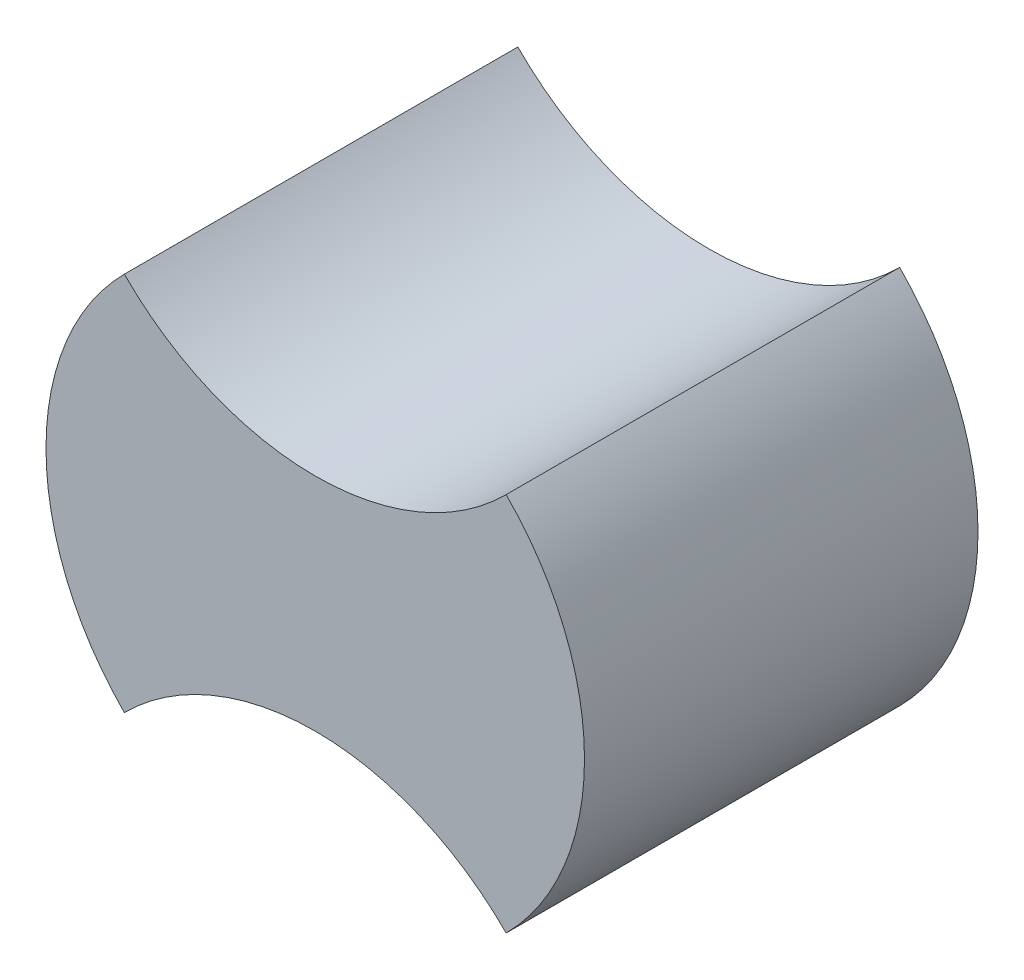
ISO-10303-21;
HEADER;
FILE_DESCRIPTION(('STEP AP214'),'2;1');
FILE_NAME('part.step','',(''),(''),'','','');
FILE_SCHEMA(('AUTOMOTIVE_DESIGN { 1 0 10303 214 1 1 1 1 }'));
ENDSEC;
DATA;
#1=APPLICATION_CONTEXT('core data for automotive mechanical design processes');
#2=APPLICATION_PROTOCOL_DEFINITION('international standard','automotive_design',2000,#1);
#3=PRODUCT_CONTEXT('',#1,'mechanical');
#4=PRODUCT('Part','Part','',(#3));
#5=PRODUCT_RELATED_PRODUCT_CATEGORY('part','',(#4));
#6=PRODUCT_DEFINITION_FORMATION('','',#4);
#7=PRODUCT_DEFINITION_CONTEXT('part definition',#1,'design');
#8=PRODUCT_DEFINITION('design','',#6,#7);
#9=PRODUCT_DEFINITION_SHAPE('','',#8);
#10=(LENGTH_UNIT() NAMED_UNIT(*) SI_UNIT(.MILLI.,.METRE.));
#11=(NAMED_UNIT(*) PLANE_ANGLE_UNIT() SI_UNIT($,.RADIAN.));
#12=(NAMED_UNIT(*) SI_UNIT($,.STERADIAN.) SOLID_ANGLE_UNIT());
#13=UNCERTAINTY_MEASURE_WITH_UNIT(LENGTH_MEASURE(1.E-05),#10,'distance_accuracy_value','');
#14=(GEOMETRIC_REPRESENTATION_CONTEXT(3) GLOBAL_UNCERTAINTY_ASSIGNED_CONTEXT((#13)) GLOBAL_UNIT_ASSIGNED_CONTEXT((#10,
#11,#12)) REPRESENTATION_CONTEXT('',''));
#15=CARTESIAN_POINT('',(0.,0.,0.));
#16=DIRECTION('',(0.,0.,1.));
#17=DIRECTION('',(1.,0.,0.));
#18=AXIS2_PLACEMENT_3D('',#15,#16,#17);
#19=CARTESIAN_POINT('',(0.,0.,57.));
#20=DIRECTION('',(0.,0.,-1.));
#21=DIRECTION('',(-1.,0.,0.));
#22=AXIS2_PLACEMENT_3D('',#19,#20,#21);
#23=CYLINDRICAL_SURFACE('',#22,39.);
#24=CARTESIAN_POINT('',(0.,0.,0.));
#25=DIRECTION('',(0.,0.,1.));
#26=DIRECTION('',(1.,0.,0.));
#27=AXIS2_PLACEMENT_3D('',#24,#25,#26);
#28=CIRCLE('',#27,39.);
#29=CARTESIAN_POINT('',(-27.6541136180497,27.5,0.));
#30=VERTEX_POINT('',#29);
#31=CARTESIAN_POINT('',(-27.6541136180497,-27.5,0.));
#32=VERTEX_POINT('',#31);
#33=EDGE_CURVE('E219',#30,#32,#28,.T.);
#34=ORIENTED_EDGE('',*,*,#33,.T.);
#35=DIRECTION('',(0.,0.,-1.));
#36=VECTOR('',#35,1.);
#37=CARTESIAN_POINT('',(-27.6541136180497,-27.5,57.));
#38=LINE('',#37,#36);
#39=CARTESIAN_POINT('',(-27.6541136180497,-27.5,57.));
#40=VERTEX_POINT('',#39);
#41=EDGE_CURVE('E11',#40,#32,#38,.T.);
#42=ORIENTED_EDGE('',*,*,#41,.F.);
#43=CARTESIAN_POINT('',(0.,0.,57.));
#44=DIRECTION('',(0.,0.,1.));
#45=DIRECTION('',(1.,0.,0.));
#46=AXIS2_PLACEMENT_3D('',#43,#44,#45);
#47=CIRCLE('',#46,39.);
#48=CARTESIAN_POINT('',(-27.6541136180497,27.5,57.));
#49=VERTEX_POINT('',#48);
#50=EDGE_CURVE('E94',#49,#40,#47,.T.);
#51=ORIENTED_EDGE('',*,*,#50,.F.);
#52=DIRECTION('',(0.,0.,-1.));
#53=VECTOR('',#52,1.);
#54=CARTESIAN_POINT('',(-27.6541136180497,27.5,57.));
#55=LINE('',#54,#53);
#56=EDGE_CURVE('E69',#49,#30,#55,.T.);
#57=ORIENTED_EDGE('',*,*,#56,.T.);
#58=EDGE_LOOP('',(#34,#42,#51,#57));
#59=FACE_BOUND('',#58,.T.);
#60=ADVANCED_FACE('F45',(#59),#23,.T.);
#61=CARTESIAN_POINT('',(0.,-55.,57.));
#62=DIRECTION('',(0.,0.,-1.));
#63=DIRECTION('',(-1.,0.,0.));
#64=AXIS2_PLACEMENT_3D('',#61,#62,#63);
#65=CYLINDRICAL_SURFACE('',#64,39.);
#66=CARTESIAN_POINT('',(0.,-55.,0.));
#67=DIRECTION('',(0.,0.,1.));
#68=DIRECTION('',(1.,0.,0.));
#69=AXIS2_PLACEMENT_3D('',#66,#67,#68);
#70=CIRCLE('',#69,39.);
#71=CARTESIAN_POINT('',(27.6541136180497,-27.5,0.));
#72=VERTEX_POINT('',#71);
#73=EDGE_CURVE('E252',#72,#32,#70,.T.);
#74=ORIENTED_EDGE('',*,*,#73,.F.);
#75=DIRECTION('',(0.,0.,-1.));
#76=VECTOR('',#75,1.);
#77=CARTESIAN_POINT('',(27.6541136180497,-27.5,57.));
#78=LINE('',#77,#76);
#79=CARTESIAN_POINT('',(27.6541136180497,-27.5,57.));
#80=VERTEX_POINT('',#79);
#81=EDGE_CURVE('E53',#80,#72,#78,.T.);
#82=ORIENTED_EDGE('',*,*,#81,.F.);
#83=CARTESIAN_POINT('',(0.,-55.,57.));
#84=DIRECTION('',(0.,0.,1.));
#85=DIRECTION('',(1.,0.,0.));
#86=AXIS2_PLACEMENT_3D('',#83,#84,#85);
#87=CIRCLE('',#86,39.);
#88=EDGE_CURVE('E239',#80,#40,#87,.T.);
#89=ORIENTED_EDGE('',*,*,#88,.T.);
#90=ORIENTED_EDGE('',*,*,#41,.T.);
#91=EDGE_LOOP('',(#74,#82,#89,#90));
#92=FACE_BOUND('',#91,.T.);
#93=ADVANCED_FACE('F277',(#92),#65,.F.);
#94=CARTESIAN_POINT('',(0.,0.,57.));
#95=DIRECTION('',(0.,0.,-1.));
#96=DIRECTION('',(-1.,0.,0.));
#97=AXIS2_PLACEMENT_3D('',#94,#95,#96);
#98=CYLINDRICAL_SURFACE('',#97,39.);
#99=CARTESIAN_POINT('',(0.,0.,0.));
#100=DIRECTION('',(0.,0.,1.));
#101=DIRECTION('',(1.,0.,0.));
#102=AXIS2_PLACEMENT_3D('',#99,#100,#101);
#103=CIRCLE('',#102,39.);
#104=CARTESIAN_POINT('',(27.6541136180497,27.5,0.));
#105=VERTEX_POINT('',#104);
#106=EDGE_CURVE('E256',#72,#105,#103,.T.);
#107=ORIENTED_EDGE('',*,*,#106,.T.);
#108=DIRECTION('',(0.,0.,-1.));
#109=VECTOR('',#108,1.);
#110=CARTESIAN_POINT('',(27.6541136180497,27.5,57.));
#111=LINE('',#110,#109);
#112=CARTESIAN_POINT('',(27.6541136180497,27.5,57.));
#113=VERTEX_POINT('',#112);
#114=EDGE_CURVE('E265',#113,#105,#111,.T.);
#115=ORIENTED_EDGE('',*,*,#114,.F.);
#116=CARTESIAN_POINT('',(0.,0.,57.));
#117=DIRECTION('',(0.,0.,1.));
#118=DIRECTION('',(1.,0.,0.));
#119=AXIS2_PLACEMENT_3D('',#116,#117,#118);
#120=CIRCLE('',#119,39.);
#121=EDGE_CURVE('E244',#80,#113,#120,.T.);
#122=ORIENTED_EDGE('',*,*,#121,.F.);
#123=ORIENTED_EDGE('',*,*,#81,.T.);
#124=EDGE_LOOP('',(#107,#115,#122,#123));
#125=FACE_BOUND('',#124,.T.);
#126=ADVANCED_FACE('F271',(#125),#98,.T.);
#127=CARTESIAN_POINT('',(0.,55.,57.));
#128=DIRECTION('',(0.,0.,-1.));
#129=DIRECTION('',(-1.,0.,0.));
#130=AXIS2_PLACEMENT_3D('',#127,#128,#129);
#131=CYLINDRICAL_SURFACE('',#130,39.);
#132=CARTESIAN_POINT('',(0.,55.,0.));
#133=DIRECTION('',(0.,0.,1.));
#134=DIRECTION('',(1.,0.,0.));
#135=AXIS2_PLACEMENT_3D('',#132,#133,#134);
#136=CIRCLE('',#135,39.);
#137=EDGE_CURVE('E240',#30,#105,#136,.T.);
#138=ORIENTED_EDGE('',*,*,#137,.F.);
#139=ORIENTED_EDGE('',*,*,#56,.F.);
#140=CARTESIAN_POINT('',(0.,55.,57.));
#141=DIRECTION('',(0.,0.,1.));
#142=DIRECTION('',(1.,0.,0.));
#143=AXIS2_PLACEMENT_3D('',#140,#141,#142);
#144=CIRCLE('',#143,39.);
#145=EDGE_CURVE('E247',#49,#113,#144,.T.);
#146=ORIENTED_EDGE('',*,*,#145,.T.);
#147=ORIENTED_EDGE('',*,*,#114,.T.);
#148=EDGE_LOOP('',(#138,#139,#146,#147));
#149=FACE_BOUND('',#148,.T.);
#150=ADVANCED_FACE('F278',(#149),#131,.F.);
#151=CARTESIAN_POINT('',(0.,-27.5,57.));
#152=DIRECTION('',(0.,0.,1.));
#153=DIRECTION('',(1.,0.,0.));
#154=AXIS2_PLACEMENT_3D('',#151,#152,#153);
#155=PLANE('',#154);
#156=ORIENTED_EDGE('',*,*,#50,.T.);
#157=ORIENTED_EDGE('',*,*,#88,.F.);
#158=ORIENTED_EDGE('',*,*,#121,.T.);
#159=ORIENTED_EDGE('',*,*,#145,.F.);
#160=EDGE_LOOP('',(#156,#157,#158,#159));
#161=FACE_BOUND('',#160,.T.);
#162=ADVANCED_FACE('F279',(#161),#155,.T.);
#163=CARTESIAN_POINT('',(0.,-27.5,0.));
#164=DIRECTION('',(0.,0.,1.));
#165=DIRECTION('',(1.,0.,0.));
#166=AXIS2_PLACEMENT_3D('',#163,#164,#165);
#167=PLANE('',#166);
#168=DIRECTION('',(-0.967177202898201,-0.254102849637725,0.));
#169=VECTOR('',#168,1.);
#170=CARTESIAN_POINT('',(16.,-2.,0.));
#171=LINE('',#170,#169);
#172=CARTESIAN_POINT('',(16.,-1.99999999999999,0.));
#173=VERTEX_POINT('',#172);
#174=CARTESIAN_POINT('',(1.52461709782635,-5.80306321738921,0.));
#175=VERTEX_POINT('',#174);
#176=EDGE_CURVE('E194',#173,#175,#171,.T.);
#177=ORIENTED_EDGE('',*,*,#176,.F.);
#178=CARTESIAN_POINT('',(16.,0.,0.));
#179=DIRECTION('',(0.,0.,-1.));
#180=DIRECTION('',(-1.,0.,0.));
#181=AXIS2_PLACEMENT_3D('',#178,#179,#180);
#182=CIRCLE('',#181,2.);
#183=CARTESIAN_POINT('',(16.,2.,0.));
#184=VERTEX_POINT('',#183);
#185=EDGE_CURVE('E60',#184,#173,#182,.T.);
#186=ORIENTED_EDGE('',*,*,#185,.F.);
#187=DIRECTION('',(0.967177202898201,-0.254102849637725,0.));
#188=VECTOR('',#187,1.);
#189=CARTESIAN_POINT('',(16.,2.,0.));
#190=LINE('',#189,#188);
#191=CARTESIAN_POINT('',(1.52461709782635,5.8030632173892,0.));
#192=VERTEX_POINT('',#191);
#193=EDGE_CURVE('E166',#192,#184,#190,.T.);
#194=ORIENTED_EDGE('',*,*,#193,.F.);
#195=CARTESIAN_POINT('',(0.,0.,0.));
#196=DIRECTION('',(0.,0.,-1.));
#197=DIRECTION('',(-1.,0.,0.));
#198=AXIS2_PLACEMENT_3D('',#195,#196,#197);
#199=CIRCLE('',#198,6.);
#200=CARTESIAN_POINT('',(-1.52461709782635,5.80306321738921,0.));
#201=VERTEX_POINT('',#200);
#202=EDGE_CURVE('E170',#201,#192,#199,.T.);
#203=ORIENTED_EDGE('',*,*,#202,.F.);
#204=DIRECTION('',(0.967177202898201,0.254102849637725,0.));
#205=VECTOR('',#204,1.);
#206=CARTESIAN_POINT('',(-16.,2.00000000000001,0.));
#207=LINE('',#206,#205);
#208=CARTESIAN_POINT('',(-16.,2.00000000000001,0.));
#209=VERTEX_POINT('',#208);
#210=EDGE_CURVE('E209',#209,#201,#207,.T.);
#211=ORIENTED_EDGE('',*,*,#210,.F.);
#212=CARTESIAN_POINT('',(-16.,0.,0.));
#213=DIRECTION('',(0.,0.,-1.));
#214=DIRECTION('',(1.,0.,0.));
#215=AXIS2_PLACEMENT_3D('',#212,#213,#214);
#216=CIRCLE('',#215,2.);
#217=CARTESIAN_POINT('',(-16.,-1.99999999999999,0.));
#218=VERTEX_POINT('',#217);
#219=EDGE_CURVE('E205',#218,#209,#216,.T.);
#220=ORIENTED_EDGE('',*,*,#219,.F.);
#221=DIRECTION('',(-0.967177202898201,0.254102849637725,0.));
#222=VECTOR('',#221,1.);
#223=CARTESIAN_POINT('',(-16.,-1.99999999999999,0.));
#224=LINE('',#223,#222);
#225=CARTESIAN_POINT('',(-1.52461709782635,-5.8030632173892,0.));
#226=VERTEX_POINT('',#225);
#227=EDGE_CURVE('E201',#226,#218,#224,.T.);
#228=ORIENTED_EDGE('',*,*,#227,.F.);
#229=CARTESIAN_POINT('',(0.,0.,0.));
#230=DIRECTION('',(0.,0.,-1.));
#231=DIRECTION('',(-1.,0.,0.));
#232=AXIS2_PLACEMENT_3D('',#229,#230,#231);
#233=CIRCLE('',#232,6.);
#234=EDGE_CURVE('E197',#175,#226,#233,.T.);
#235=ORIENTED_EDGE('',*,*,#234,.F.);
#236=EDGE_LOOP('',(#177,#186,#194,#203,#211,#220,#228,#235));
#237=FACE_BOUND('',#236,.T.);
#238=ORIENTED_EDGE('',*,*,#33,.F.);
#239=ORIENTED_EDGE('',*,*,#137,.T.);
#240=ORIENTED_EDGE('',*,*,#106,.F.);
#241=ORIENTED_EDGE('',*,*,#73,.T.);
#242=EDGE_LOOP('',(#238,#239,#240,#241));
#243=FACE_BOUND('',#242,.T.);
#244=ADVANCED_FACE('F276',(#237,#243),#167,.F.);
#245=CARTESIAN_POINT('',(16.,0.,3.));
#246=DIRECTION('',(0.,0.,-1.));
#247=DIRECTION('',(-1.,0.,0.));
#248=AXIS2_PLACEMENT_3D('',#245,#246,#247);
#249=CYLINDRICAL_SURFACE('',#248,2.);
#250=ORIENTED_EDGE('',*,*,#185,.T.);
#251=DIRECTION('',(0.,0.,-1.));
#252=VECTOR('',#251,1.);
#253=CARTESIAN_POINT('',(16.,-2.,3.));
#254=LINE('',#253,#252);
#255=CARTESIAN_POINT('',(16.,-2.,3.));
#256=VERTEX_POINT('',#255);
#257=EDGE_CURVE('E140',#256,#173,#254,.T.);
#258=ORIENTED_EDGE('',*,*,#257,.F.);
#259=CARTESIAN_POINT('',(16.,0.,3.));
#260=DIRECTION('',(0.,0.,-1.));
#261=DIRECTION('',(-1.,0.,0.));
#262=AXIS2_PLACEMENT_3D('',#259,#260,#261);
#263=CIRCLE('',#262,2.);
#264=CARTESIAN_POINT('',(16.,2.,3.));
#265=VERTEX_POINT('',#264);
#266=EDGE_CURVE('E144',#265,#256,#263,.T.);
#267=ORIENTED_EDGE('',*,*,#266,.F.);
#268=DIRECTION('',(0.,0.,-1.));
#269=VECTOR('',#268,1.);
#270=CARTESIAN_POINT('',(16.,2.,3.));
#271=LINE('',#270,#269);
#272=EDGE_CURVE('E216',#265,#184,#271,.T.);
#273=ORIENTED_EDGE('',*,*,#272,.T.);
#274=EDGE_LOOP('',(#250,#258,#267,#273));
#275=FACE_BOUND('',#274,.T.);
#276=ADVANCED_FACE('F142',(#275),#249,.F.);
#277=CARTESIAN_POINT('',(16.,2.,3.));
#278=DIRECTION('',(0.254102849637725,0.967177202898201,0.));
#279=DIRECTION('',(-0.967177202898201,0.254102849637725,0.));
#280=AXIS2_PLACEMENT_3D('',#277,#278,#279);
#281=PLANE('',#280);
#282=ORIENTED_EDGE('',*,*,#193,.T.);
#283=ORIENTED_EDGE('',*,*,#272,.F.);
#284=DIRECTION('',(0.967177202898201,-0.254102849637725,0.));
#285=VECTOR('',#284,1.);
#286=CARTESIAN_POINT('',(16.,2.,3.));
#287=LINE('',#286,#285);
#288=CARTESIAN_POINT('',(1.52461709782635,5.8030632173892,3.));
#289=VERTEX_POINT('',#288);
#290=EDGE_CURVE('E151',#289,#265,#287,.T.);
#291=ORIENTED_EDGE('',*,*,#290,.F.);
#292=DIRECTION('',(0.,0.,-1.));
#293=VECTOR('',#292,1.);
#294=CARTESIAN_POINT('',(1.52461709782635,5.8030632173892,3.));
#295=LINE('',#294,#293);
#296=EDGE_CURVE('E220',#289,#192,#295,.T.);
#297=ORIENTED_EDGE('',*,*,#296,.T.);
#298=EDGE_LOOP('',(#282,#283,#291,#297));
#299=FACE_BOUND('',#298,.T.);
#300=ADVANCED_FACE('F325',(#299),#281,.F.);
#301=CARTESIAN_POINT('',(0.,0.,3.));
#302=DIRECTION('',(0.,0.,-1.));
#303=DIRECTION('',(-1.,0.,0.));
#304=AXIS2_PLACEMENT_3D('',#301,#302,#303);
#305=CYLINDRICAL_SURFACE('',#304,6.);
#306=ORIENTED_EDGE('',*,*,#202,.T.);
#307=ORIENTED_EDGE('',*,*,#296,.F.);
#308=CARTESIAN_POINT('',(0.,0.,3.));
#309=DIRECTION('',(0.,0.,-1.));
#310=DIRECTION('',(-1.,0.,0.));
#311=AXIS2_PLACEMENT_3D('',#308,#309,#310);
#312=CIRCLE('',#311,6.);
#313=CARTESIAN_POINT('',(-1.52461709782635,5.80306321738921,3.));
#314=VERTEX_POINT('',#313);
#315=EDGE_CURVE('E187',#314,#289,#312,.T.);
#316=ORIENTED_EDGE('',*,*,#315,.F.);
#317=DIRECTION('',(0.,0.,-1.));
#318=VECTOR('',#317,1.);
#319=CARTESIAN_POINT('',(-1.52461709782635,5.80306321738921,3.));
#320=LINE('',#319,#318);
#321=EDGE_CURVE('E223',#314,#201,#320,.T.);
#322=ORIENTED_EDGE('',*,*,#321,.T.);
#323=EDGE_LOOP('',(#306,#307,#316,#322));
#324=FACE_BOUND('',#323,.T.);
#325=ADVANCED_FACE('F333',(#324),#305,.F.);
#326=CARTESIAN_POINT('',(-16.,2.00000000000001,3.));
#327=DIRECTION('',(-0.254102849637725,0.967177202898201,0.));
#328=DIRECTION('',(-0.967177202898201,-0.254102849637725,0.));
#329=AXIS2_PLACEMENT_3D('',#326,#327,#328);
#330=PLANE('',#329);
#331=ORIENTED_EDGE('',*,*,#210,.T.);
#332=ORIENTED_EDGE('',*,*,#321,.F.);
#333=DIRECTION('',(0.967177202898201,0.254102849637725,0.));
#334=VECTOR('',#333,1.);
#335=CARTESIAN_POINT('',(-16.,2.00000000000001,3.));
#336=LINE('',#335,#334);
#337=CARTESIAN_POINT('',(-16.,2.00000000000001,3.));
#338=VERTEX_POINT('',#337);
#339=EDGE_CURVE('E183',#338,#314,#336,.T.);
#340=ORIENTED_EDGE('',*,*,#339,.F.);
#341=DIRECTION('',(0.,0.,-1.));
#342=VECTOR('',#341,1.);
#343=CARTESIAN_POINT('',(-16.,2.00000000000001,3.));
#344=LINE('',#343,#342);
#345=EDGE_CURVE('E226',#338,#209,#344,.T.);
#346=ORIENTED_EDGE('',*,*,#345,.T.);
#347=EDGE_LOOP('',(#331,#332,#340,#346));
#348=FACE_BOUND('',#347,.T.);
#349=ADVANCED_FACE('F343',(#348),#330,.F.);
#350=CARTESIAN_POINT('',(-16.,0.,3.));
#351=DIRECTION('',(0.,0.,-1.));
#352=DIRECTION('',(-1.,0.,0.));
#353=AXIS2_PLACEMENT_3D('',#350,#351,#352);
#354=CYLINDRICAL_SURFACE('',#353,2.);
#355=ORIENTED_EDGE('',*,*,#219,.T.);
#356=ORIENTED_EDGE('',*,*,#345,.F.);
#357=CARTESIAN_POINT('',(-16.,0.,3.));
#358=DIRECTION('',(0.,0.,-1.));
#359=DIRECTION('',(1.,0.,0.));
#360=AXIS2_PLACEMENT_3D('',#357,#358,#359);
#361=CIRCLE('',#360,2.);
#362=CARTESIAN_POINT('',(-16.,-1.99999999999999,3.));
#363=VERTEX_POINT('',#362);
#364=EDGE_CURVE('E179',#363,#338,#361,.T.);
#365=ORIENTED_EDGE('',*,*,#364,.F.);
#366=DIRECTION('',(0.,0.,-1.));
#367=VECTOR('',#366,1.);
#368=CARTESIAN_POINT('',(-16.,-1.99999999999999,3.));
#369=LINE('',#368,#367);
#370=EDGE_CURVE('E229',#363,#218,#369,.T.);
#371=ORIENTED_EDGE('',*,*,#370,.T.);
#372=EDGE_LOOP('',(#355,#356,#365,#371));
#373=FACE_BOUND('',#372,.T.);
#374=ADVANCED_FACE('F353',(#373),#354,.F.);
#375=CARTESIAN_POINT('',(-16.,-1.99999999999999,3.));
#376=DIRECTION('',(-0.254102849637725,-0.967177202898201,0.));
#377=DIRECTION('',(0.967177202898201,-0.254102849637725,0.));
#378=AXIS2_PLACEMENT_3D('',#375,#376,#377);
#379=PLANE('',#378);
#380=ORIENTED_EDGE('',*,*,#227,.T.);
#381=ORIENTED_EDGE('',*,*,#370,.F.);
#382=DIRECTION('',(-0.967177202898201,0.254102849637725,0.));
#383=VECTOR('',#382,1.);
#384=CARTESIAN_POINT('',(-16.,-1.99999999999999,3.));
#385=LINE('',#384,#383);
#386=CARTESIAN_POINT('',(-1.52461709782635,-5.8030632173892,3.));
#387=VERTEX_POINT('',#386);
#388=EDGE_CURVE('E175',#387,#363,#385,.T.);
#389=ORIENTED_EDGE('',*,*,#388,.F.);
#390=DIRECTION('',(0.,0.,-1.));
#391=VECTOR('',#390,1.);
#392=CARTESIAN_POINT('',(-1.52461709782635,-5.8030632173892,3.));
#393=LINE('',#392,#391);
#394=EDGE_CURVE('E232',#387,#226,#393,.T.);
#395=ORIENTED_EDGE('',*,*,#394,.T.);
#396=EDGE_LOOP('',(#380,#381,#389,#395));
#397=FACE_BOUND('',#396,.T.);
#398=ADVANCED_FACE('F363',(#397),#379,.F.);
#399=CARTESIAN_POINT('',(0.,0.,3.));
#400=DIRECTION('',(0.,0.,-1.));
#401=DIRECTION('',(-1.,0.,0.));
#402=AXIS2_PLACEMENT_3D('',#399,#400,#401);
#403=CYLINDRICAL_SURFACE('',#402,6.);
#404=ORIENTED_EDGE('',*,*,#234,.T.);
#405=ORIENTED_EDGE('',*,*,#394,.F.);
#406=CARTESIAN_POINT('',(0.,0.,3.));
#407=DIRECTION('',(0.,0.,-1.));
#408=DIRECTION('',(-1.,0.,0.));
#409=AXIS2_PLACEMENT_3D('',#406,#407,#408);
#410=CIRCLE('',#409,6.);
#411=CARTESIAN_POINT('',(1.52461709782635,-5.80306321738921,3.));
#412=VERTEX_POINT('',#411);
#413=EDGE_CURVE('E160',#412,#387,#410,.T.);
#414=ORIENTED_EDGE('',*,*,#413,.F.);
#415=DIRECTION('',(0.,0.,-1.));
#416=VECTOR('',#415,1.);
#417=CARTESIAN_POINT('',(1.52461709782635,-5.80306321738921,3.));
#418=LINE('',#417,#416);
#419=EDGE_CURVE('E150',#412,#175,#418,.T.);
#420=ORIENTED_EDGE('',*,*,#419,.T.);
#421=EDGE_LOOP('',(#404,#405,#414,#420));
#422=FACE_BOUND('',#421,.T.);
#423=ADVANCED_FACE('F373',(#422),#403,.F.);
#424=CARTESIAN_POINT('',(16.,-2.,3.));
#425=DIRECTION('',(0.254102849637725,-0.967177202898201,0.));
#426=DIRECTION('',(0.967177202898201,0.254102849637725,0.));
#427=AXIS2_PLACEMENT_3D('',#424,#425,#426);
#428=PLANE('',#427);
#429=ORIENTED_EDGE('',*,*,#176,.T.);
#430=ORIENTED_EDGE('',*,*,#419,.F.);
#431=DIRECTION('',(-0.967177202898201,-0.254102849637725,0.));
#432=VECTOR('',#431,1.);
#433=CARTESIAN_POINT('',(16.,-2.,3.));
#434=LINE('',#433,#432);
#435=EDGE_CURVE('E154',#256,#412,#434,.T.);
#436=ORIENTED_EDGE('',*,*,#435,.F.);
#437=ORIENTED_EDGE('',*,*,#257,.T.);
#438=EDGE_LOOP('',(#429,#430,#436,#437));
#439=FACE_BOUND('',#438,.T.);
#440=ADVANCED_FACE('F155',(#439),#428,.F.);
#441=CARTESIAN_POINT('',(16.,0.,3.));
#442=DIRECTION('',(0.,0.,-1.));
#443=DIRECTION('',(-1.,0.,0.));
#444=AXIS2_PLACEMENT_3D('',#441,#442,#443);
#445=PLANE('',#444);
#446=ORIENTED_EDGE('',*,*,#266,.T.);
#447=ORIENTED_EDGE('',*,*,#435,.T.);
#448=ORIENTED_EDGE('',*,*,#413,.T.);
#449=ORIENTED_EDGE('',*,*,#388,.T.);
#450=ORIENTED_EDGE('',*,*,#364,.T.);
#451=ORIENTED_EDGE('',*,*,#339,.T.);
#452=ORIENTED_EDGE('',*,*,#315,.T.);
#453=ORIENTED_EDGE('',*,*,#290,.T.);
#454=EDGE_LOOP('',(#446,#447,#448,#449,#450,#451,#452,#453));
#455=FACE_BOUND('',#454,.T.);
#456=ADVANCED_FACE('F162',(#455),#445,.T.);
#457=CLOSED_SHELL('',(#60,#93,#126,#150,#162,#244,#276,#300,#325,#349,#374,#398,#423,#440,#456));
#458=MANIFOLD_SOLID_BREP('B2',#457);
#459=ADVANCED_BREP_SHAPE_REPRESENTATION('',(#18,#458),#14);
#460=SHAPE_DEFINITION_REPRESENTATION(#9,#459);
ENDSEC;
END-ISO-10303-21;
